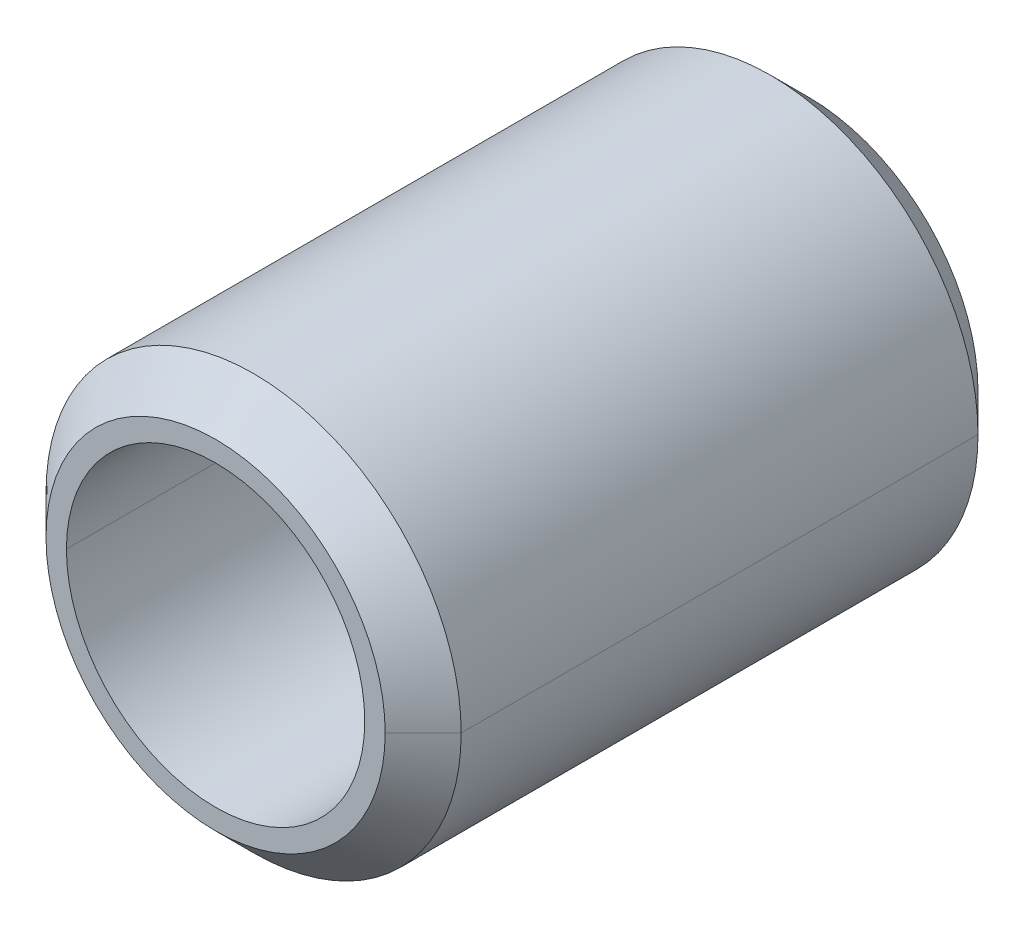
ISO-10303-21;
HEADER;
FILE_DESCRIPTION(('STEP AP214'),'2;1');
FILE_NAME('part.step','',(''),(''),'','','');
FILE_SCHEMA(('AUTOMOTIVE_DESIGN { 1 0 10303 214 1 1 1 1 }'));
ENDSEC;
DATA;
#1=APPLICATION_CONTEXT('core data for automotive mechanical design processes');
#2=APPLICATION_PROTOCOL_DEFINITION('international standard','automotive_design',2000,#1);
#3=PRODUCT_CONTEXT('',#1,'mechanical');
#4=PRODUCT('Part','Part','',(#3));
#5=PRODUCT_RELATED_PRODUCT_CATEGORY('part','',(#4));
#6=PRODUCT_DEFINITION_FORMATION('','',#4);
#7=PRODUCT_DEFINITION_CONTEXT('part definition',#1,'design');
#8=PRODUCT_DEFINITION('design','',#6,#7);
#9=PRODUCT_DEFINITION_SHAPE('','',#8);
#10=(LENGTH_UNIT() NAMED_UNIT(*) SI_UNIT(.MILLI.,.METRE.));
#11=(NAMED_UNIT(*) PLANE_ANGLE_UNIT() SI_UNIT($,.RADIAN.));
#12=(NAMED_UNIT(*) SI_UNIT($,.STERADIAN.) SOLID_ANGLE_UNIT());
#13=UNCERTAINTY_MEASURE_WITH_UNIT(LENGTH_MEASURE(1.E-05),#10,'distance_accuracy_value','');
#14=(GEOMETRIC_REPRESENTATION_CONTEXT(3) GLOBAL_UNCERTAINTY_ASSIGNED_CONTEXT((#13)) GLOBAL_UNIT_ASSIGNED_CONTEXT((#10,
#11,#12)) REPRESENTATION_CONTEXT('',''));
#15=CARTESIAN_POINT('',(0.,0.,0.));
#16=DIRECTION('',(0.,0.,1.));
#17=DIRECTION('',(1.,0.,0.));
#18=AXIS2_PLACEMENT_3D('',#15,#16,#17);
#19=CARTESIAN_POINT('',(0.,2.26695,3.9624));
#20=DIRECTION('',(0.,0.,1.));
#21=DIRECTION('',(1.,0.,0.));
#22=AXIS2_PLACEMENT_3D('',#19,#20,#21);
#23=PLANE('',#22);
#24=CARTESIAN_POINT('',(0.,0.,3.9624));
#25=DIRECTION('',(0.,0.,-1.));
#26=DIRECTION('',(-1.,0.,0.));
#27=AXIS2_PLACEMENT_3D('',#24,#25,#26);
#28=CIRCLE('',#27,1.9939);
#29=CARTESIAN_POINT('',(-1.9939,0.,3.9624));
#30=VERTEX_POINT('',#29);
#31=CARTESIAN_POINT('',(1.9939,0.,3.9624));
#32=VERTEX_POINT('',#31);
#33=EDGE_CURVE('E11',#30,#32,#28,.T.);
#34=ORIENTED_EDGE('',*,*,#33,.T.);
#35=CARTESIAN_POINT('',(0.,0.,3.9624));
#36=DIRECTION('',(0.,0.,-1.));
#37=DIRECTION('',(-1.,0.,0.));
#38=AXIS2_PLACEMENT_3D('',#35,#36,#37);
#39=CIRCLE('',#38,1.9939);
#40=EDGE_CURVE('E25',#32,#30,#39,.T.);
#41=ORIENTED_EDGE('',*,*,#40,.T.);
#42=EDGE_LOOP('',(#34,#41));
#43=FACE_BOUND('',#42,.T.);
#44=CARTESIAN_POINT('',(0.,0.,3.9624));
#45=DIRECTION('',(0.,0.,-1.));
#46=DIRECTION('',(-1.,0.,0.));
#47=AXIS2_PLACEMENT_3D('',#44,#45,#46);
#48=CIRCLE('',#47,2.26695);
#49=CARTESIAN_POINT('',(-2.26695,0.,3.9624));
#50=VERTEX_POINT('',#49);
#51=CARTESIAN_POINT('',(2.2669499999987,0.,3.9623999999987));
#52=VERTEX_POINT('',#51);
#53=EDGE_CURVE('E147',#50,#52,#48,.T.);
#54=ORIENTED_EDGE('',*,*,#53,.F.);
#55=CARTESIAN_POINT('',(0.,0.,3.9624));
#56=DIRECTION('',(0.,0.,-1.));
#57=DIRECTION('',(-1.,0.,0.));
#58=AXIS2_PLACEMENT_3D('',#55,#56,#57);
#59=CIRCLE('',#58,2.26695);
#60=EDGE_CURVE('E142',#52,#50,#59,.T.);
#61=ORIENTED_EDGE('',*,*,#60,.F.);
#62=EDGE_LOOP('',(#54,#61));
#63=FACE_BOUND('',#62,.T.);
#64=ADVANCED_FACE('F17',(#43,#63),#23,.T.);
#65=CARTESIAN_POINT('',(0.,0.,3.4544));
#66=DIRECTION('',(0.,0.,-1.));
#67=DIRECTION('',(0.,1.,0.));
#68=AXIS2_PLACEMENT_3D('',#65,#66,#67);
#69=CONICAL_SURFACE('',#68,2.77495,0.7853981634);
#70=ORIENTED_EDGE('',*,*,#60,.T.);
#71=DIRECTION('',(-0.707106781188351,0.,-0.707106781184744));
#72=VECTOR('',#71,1.);
#73=CARTESIAN_POINT('',(-2.2669499999987,0.,3.9623999999987));
#74=LINE('',#73,#72);
#75=CARTESIAN_POINT('',(-2.77495,0.,3.4544));
#76=VERTEX_POINT('',#75);
#77=EDGE_CURVE('E138',#50,#76,#74,.T.);
#78=ORIENTED_EDGE('',*,*,#77,.T.);
#79=CARTESIAN_POINT('',(0.,0.,3.4544));
#80=DIRECTION('',(0.,0.,-1.));
#81=DIRECTION('',(-1.,0.,0.));
#82=AXIS2_PLACEMENT_3D('',#79,#80,#81);
#83=CIRCLE('',#82,2.77495);
#84=CARTESIAN_POINT('',(2.77495,0.,3.4544));
#85=VERTEX_POINT('',#84);
#86=EDGE_CURVE('E133',#85,#76,#83,.T.);
#87=ORIENTED_EDGE('',*,*,#86,.F.);
#88=DIRECTION('',(0.707106781188352,0.,-0.707106781184743));
#89=VECTOR('',#88,1.);
#90=CARTESIAN_POINT('',(2.2669499999987,0.,3.9623999999987));
#91=LINE('',#90,#89);
#92=EDGE_CURVE('E128',#52,#85,#91,.T.);
#93=ORIENTED_EDGE('',*,*,#92,.F.);
#94=EDGE_LOOP('',(#70,#78,#87,#93));
#95=FACE_BOUND('',#94,.T.);
#96=ADVANCED_FACE('F163',(#95),#69,.T.);
#97=CARTESIAN_POINT('',(0.,0.,3.4544));
#98=DIRECTION('',(0.,0.,-1.));
#99=DIRECTION('',(0.,-1.,0.));
#100=AXIS2_PLACEMENT_3D('',#97,#98,#99);
#101=CONICAL_SURFACE('',#100,2.77495,0.7853981634);
#102=CARTESIAN_POINT('',(0.,0.,3.4544));
#103=DIRECTION('',(0.,0.,-1.));
#104=DIRECTION('',(-1.,0.,0.));
#105=AXIS2_PLACEMENT_3D('',#102,#103,#104);
#106=CIRCLE('',#105,2.77495);
#107=EDGE_CURVE('E123',#76,#85,#106,.T.);
#108=ORIENTED_EDGE('',*,*,#107,.F.);
#109=ORIENTED_EDGE('',*,*,#77,.F.);
#110=ORIENTED_EDGE('',*,*,#53,.T.);
#111=ORIENTED_EDGE('',*,*,#92,.T.);
#112=EDGE_LOOP('',(#108,#109,#110,#111));
#113=FACE_BOUND('',#112,.T.);
#114=ADVANCED_FACE('F159',(#113),#101,.T.);
#115=CARTESIAN_POINT('',(0.,0.,-3.9624));
#116=DIRECTION('',(0.,0.,1.));
#117=DIRECTION('',(0.,-1.,0.));
#118=AXIS2_PLACEMENT_3D('',#115,#116,#117);
#119=CYLINDRICAL_SURFACE('',#118,2.77495);
#120=CARTESIAN_POINT('',(0.,0.,-3.4544));
#121=DIRECTION('',(0.,0.,-1.));
#122=DIRECTION('',(-1.,0.,0.));
#123=AXIS2_PLACEMENT_3D('',#120,#121,#122);
#124=CIRCLE('',#123,2.77495);
#125=CARTESIAN_POINT('',(-2.77495,0.,-3.4544));
#126=VERTEX_POINT('',#125);
#127=CARTESIAN_POINT('',(2.7749500000013,0.,-3.4544000000013));
#128=VERTEX_POINT('',#127);
#129=EDGE_CURVE('E118',#126,#128,#124,.T.);
#130=ORIENTED_EDGE('',*,*,#129,.F.);
#131=DIRECTION('',(0.,0.,1.));
#132=VECTOR('',#131,1.);
#133=CARTESIAN_POINT('',(-2.77495,0.,-3.4544));
#134=LINE('',#133,#132);
#135=EDGE_CURVE('E113',#126,#76,#134,.T.);
#136=ORIENTED_EDGE('',*,*,#135,.T.);
#137=ORIENTED_EDGE('',*,*,#107,.T.);
#138=DIRECTION('',(0.,0.,1.));
#139=VECTOR('',#138,1.);
#140=CARTESIAN_POINT('',(2.77495,0.,-3.4544));
#141=LINE('',#140,#139);
#142=EDGE_CURVE('E108',#128,#85,#141,.T.);
#143=ORIENTED_EDGE('',*,*,#142,.F.);
#144=EDGE_LOOP('',(#130,#136,#137,#143));
#145=FACE_BOUND('',#144,.T.);
#146=ADVANCED_FACE('F169',(#145),#119,.T.);
#147=CARTESIAN_POINT('',(0.,0.,-3.9624));
#148=DIRECTION('',(0.,0.,1.));
#149=DIRECTION('',(0.,1.,0.));
#150=AXIS2_PLACEMENT_3D('',#147,#148,#149);
#151=CYLINDRICAL_SURFACE('',#150,2.77495);
#152=ORIENTED_EDGE('',*,*,#86,.T.);
#153=ORIENTED_EDGE('',*,*,#135,.F.);
#154=CARTESIAN_POINT('',(0.,0.,-3.4544));
#155=DIRECTION('',(0.,0.,-1.));
#156=DIRECTION('',(-1.,0.,0.));
#157=AXIS2_PLACEMENT_3D('',#154,#155,#156);
#158=CIRCLE('',#157,2.77495);
#159=EDGE_CURVE('E103',#128,#126,#158,.T.);
#160=ORIENTED_EDGE('',*,*,#159,.F.);
#161=ORIENTED_EDGE('',*,*,#142,.T.);
#162=EDGE_LOOP('',(#152,#153,#160,#161));
#163=FACE_BOUND('',#162,.T.);
#164=ADVANCED_FACE('F166',(#163),#151,.T.);
#165=CARTESIAN_POINT('',(0.,0.,-3.9624));
#166=DIRECTION('',(0.,0.,1.));
#167=DIRECTION('',(0.,1.,0.));
#168=AXIS2_PLACEMENT_3D('',#165,#166,#167);
#169=CONICAL_SURFACE('',#168,2.26695,0.7853981634);
#170=ORIENTED_EDGE('',*,*,#159,.T.);
#171=DIRECTION('',(-0.707106781188351,0.,0.707106781184744));
#172=VECTOR('',#171,1.);
#173=CARTESIAN_POINT('',(-2.26695,0.,-3.9624));
#174=LINE('',#173,#172);
#175=CARTESIAN_POINT('',(-2.26695,0.,-3.9624));
#176=VERTEX_POINT('',#175);
#177=EDGE_CURVE('E98',#176,#126,#174,.T.);
#178=ORIENTED_EDGE('',*,*,#177,.F.);
#179=CARTESIAN_POINT('',(0.,0.,-3.9624));
#180=DIRECTION('',(0.,0.,-1.));
#181=DIRECTION('',(-1.,0.,0.));
#182=AXIS2_PLACEMENT_3D('',#179,#180,#181);
#183=CIRCLE('',#182,2.26695);
#184=CARTESIAN_POINT('',(2.26695,0.,-3.9624));
#185=VERTEX_POINT('',#184);
#186=EDGE_CURVE('E93',#185,#176,#183,.T.);
#187=ORIENTED_EDGE('',*,*,#186,.F.);
#188=DIRECTION('',(0.707106781188351,0.,0.707106781184744));
#189=VECTOR('',#188,1.);
#190=CARTESIAN_POINT('',(2.26695,0.,-3.9624));
#191=LINE('',#190,#189);
#192=EDGE_CURVE('E82',#185,#128,#191,.T.);
#193=ORIENTED_EDGE('',*,*,#192,.T.);
#194=EDGE_LOOP('',(#170,#178,#187,#193));
#195=FACE_BOUND('',#194,.T.);
#196=ADVANCED_FACE('F175',(#195),#169,.T.);
#197=CARTESIAN_POINT('',(0.,0.,-3.9624));
#198=DIRECTION('',(0.,0.,1.));
#199=DIRECTION('',(0.,-1.,0.));
#200=AXIS2_PLACEMENT_3D('',#197,#198,#199);
#201=CONICAL_SURFACE('',#200,2.26695,0.7853981634);
#202=CARTESIAN_POINT('',(0.,0.,-3.9624));
#203=DIRECTION('',(0.,0.,-1.));
#204=DIRECTION('',(-1.,0.,0.));
#205=AXIS2_PLACEMENT_3D('',#202,#203,#204);
#206=CIRCLE('',#205,2.26695);
#207=EDGE_CURVE('E79',#176,#185,#206,.T.);
#208=ORIENTED_EDGE('',*,*,#207,.F.);
#209=ORIENTED_EDGE('',*,*,#177,.T.);
#210=ORIENTED_EDGE('',*,*,#129,.T.);
#211=ORIENTED_EDGE('',*,*,#192,.F.);
#212=EDGE_LOOP('',(#208,#209,#210,#211));
#213=FACE_BOUND('',#212,.T.);
#214=ADVANCED_FACE('F173',(#213),#201,.T.);
#215=CARTESIAN_POINT('',(0.,1.9939,-3.9624));
#216=DIRECTION('',(0.,0.,-1.));
#217=DIRECTION('',(-1.,0.,0.));
#218=AXIS2_PLACEMENT_3D('',#215,#216,#217);
#219=PLANE('',#218);
#220=ORIENTED_EDGE('',*,*,#207,.T.);
#221=ORIENTED_EDGE('',*,*,#186,.T.);
#222=EDGE_LOOP('',(#220,#221));
#223=FACE_BOUND('',#222,.T.);
#224=CARTESIAN_POINT('',(0.,0.,-3.9624));
#225=DIRECTION('',(0.,0.,-1.));
#226=DIRECTION('',(-1.,0.,0.));
#227=AXIS2_PLACEMENT_3D('',#224,#225,#226);
#228=CIRCLE('',#227,1.9939);
#229=CARTESIAN_POINT('',(-1.9939,0.,-3.9624));
#230=VERTEX_POINT('',#229);
#231=CARTESIAN_POINT('',(1.9939,0.,-3.9624));
#232=VERTEX_POINT('',#231);
#233=EDGE_CURVE('E68',#230,#232,#228,.T.);
#234=ORIENTED_EDGE('',*,*,#233,.F.);
#235=CARTESIAN_POINT('',(0.,0.,-3.9624));
#236=DIRECTION('',(0.,0.,-1.));
#237=DIRECTION('',(-1.,0.,0.));
#238=AXIS2_PLACEMENT_3D('',#235,#236,#237);
#239=CIRCLE('',#238,1.9939);
#240=EDGE_CURVE('E64',#232,#230,#239,.T.);
#241=ORIENTED_EDGE('',*,*,#240,.F.);
#242=EDGE_LOOP('',(#234,#241));
#243=FACE_BOUND('',#242,.T.);
#244=ADVANCED_FACE('F66',(#223,#243),#219,.T.);
#245=CARTESIAN_POINT('',(0.,0.,-3.9624));
#246=DIRECTION('',(0.,0.,1.));
#247=DIRECTION('',(0.,1.,0.));
#248=AXIS2_PLACEMENT_3D('',#245,#246,#247);
#249=CYLINDRICAL_SURFACE('',#248,1.9939);
#250=ORIENTED_EDGE('',*,*,#40,.F.);
#251=DIRECTION('',(0.,0.,1.));
#252=VECTOR('',#251,1.);
#253=CARTESIAN_POINT('',(1.9939,0.,-3.9624));
#254=LINE('',#253,#252);
#255=EDGE_CURVE('E71',#232,#32,#254,.T.);
#256=ORIENTED_EDGE('',*,*,#255,.F.);
#257=ORIENTED_EDGE('',*,*,#240,.T.);
#258=DIRECTION('',(0.,0.,1.));
#259=VECTOR('',#258,1.);
#260=CARTESIAN_POINT('',(-1.9939,0.,-3.9624));
#261=LINE('',#260,#259);
#262=EDGE_CURVE('E76',#230,#30,#261,.T.);
#263=ORIENTED_EDGE('',*,*,#262,.T.);
#264=EDGE_LOOP('',(#250,#256,#257,#263));
#265=FACE_BOUND('',#264,.T.);
#266=ADVANCED_FACE('F74',(#265),#249,.F.);
#267=CARTESIAN_POINT('',(0.,0.,-3.9624));
#268=DIRECTION('',(0.,0.,1.));
#269=DIRECTION('',(0.,-1.,0.));
#270=AXIS2_PLACEMENT_3D('',#267,#268,#269);
#271=CYLINDRICAL_SURFACE('',#270,1.9939);
#272=ORIENTED_EDGE('',*,*,#233,.T.);
#273=ORIENTED_EDGE('',*,*,#255,.T.);
#274=ORIENTED_EDGE('',*,*,#33,.F.);
#275=ORIENTED_EDGE('',*,*,#262,.F.);
#276=EDGE_LOOP('',(#272,#273,#274,#275));
#277=FACE_BOUND('',#276,.T.);
#278=ADVANCED_FACE('F78',(#277),#271,.F.);
#279=CLOSED_SHELL('',(#64,#96,#114,#146,#164,#196,#214,#244,#266,#278));
#280=MANIFOLD_SOLID_BREP('B1',#279);
#281=ADVANCED_BREP_SHAPE_REPRESENTATION('',(#18,#280),#14);
#282=SHAPE_DEFINITION_REPRESENTATION(#9,#281);
ENDSEC;
END-ISO-10303-21;
